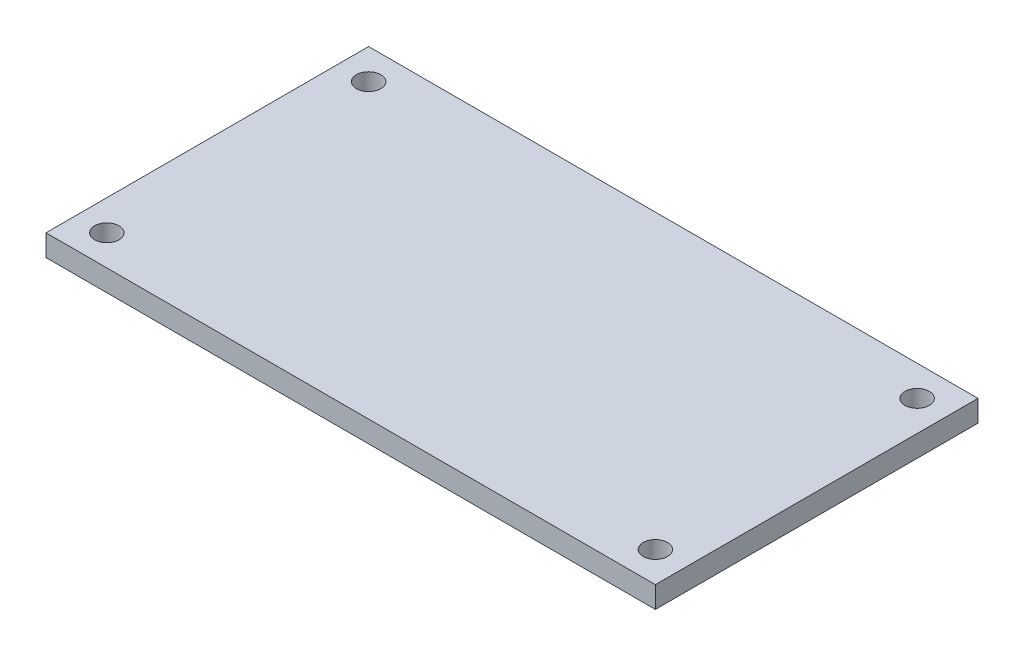
ISO-10303-21;
HEADER;
FILE_DESCRIPTION(('STEP AP214'),'2;1');
FILE_NAME('part.step','',(''),(''),'','','');
FILE_SCHEMA(('AUTOMOTIVE_DESIGN { 1 0 10303 214 1 1 1 1 }'));
ENDSEC;
DATA;
#1=APPLICATION_CONTEXT('core data for automotive mechanical design processes');
#2=APPLICATION_PROTOCOL_DEFINITION('international standard','automotive_design',2000,#1);
#3=PRODUCT_CONTEXT('',#1,'mechanical');
#4=PRODUCT('Part','Part','',(#3));
#5=PRODUCT_RELATED_PRODUCT_CATEGORY('part','',(#4));
#6=PRODUCT_DEFINITION_FORMATION('','',#4);
#7=PRODUCT_DEFINITION_CONTEXT('part definition',#1,'design');
#8=PRODUCT_DEFINITION('design','',#6,#7);
#9=PRODUCT_DEFINITION_SHAPE('','',#8);
#10=(LENGTH_UNIT() NAMED_UNIT(*) SI_UNIT(.MILLI.,.METRE.));
#11=(NAMED_UNIT(*) PLANE_ANGLE_UNIT() SI_UNIT($,.RADIAN.));
#12=(NAMED_UNIT(*) SI_UNIT($,.STERADIAN.) SOLID_ANGLE_UNIT());
#13=UNCERTAINTY_MEASURE_WITH_UNIT(LENGTH_MEASURE(1.E-05),#10,'distance_accuracy_value','');
#14=(GEOMETRIC_REPRESENTATION_CONTEXT(3) GLOBAL_UNCERTAINTY_ASSIGNED_CONTEXT((#13)) GLOBAL_UNIT_ASSIGNED_CONTEXT((#10,
#11,#12)) REPRESENTATION_CONTEXT('',''));
#15=CARTESIAN_POINT('',(0.,0.,0.));
#16=DIRECTION('',(0.,0.,1.));
#17=DIRECTION('',(1.,0.,0.));
#18=AXIS2_PLACEMENT_3D('',#15,#16,#17);
#19=CARTESIAN_POINT('',(0.,3.,0.));
#20=DIRECTION('',(0.,-1.,0.));
#21=DIRECTION('',(0.,0.,-1.));
#22=AXIS2_PLACEMENT_3D('',#19,#20,#21);
#23=PLANE('',#22);
#24=DIRECTION('',(0.,0.,1.));
#25=VECTOR('',#24,1.);
#26=CARTESIAN_POINT('',(0.,3.,0.));
#27=LINE('',#26,#25);
#28=CARTESIAN_POINT('',(0.,3.,-45.));
#29=VERTEX_POINT('',#28);
#30=CARTESIAN_POINT('',(0.,3.,0.));
#31=VERTEX_POINT('',#30);
#32=EDGE_CURVE('E94',#29,#31,#27,.T.);
#33=ORIENTED_EDGE('',*,*,#32,.T.);
#34=DIRECTION('',(1.,0.,0.));
#35=VECTOR('',#34,1.);
#36=CARTESIAN_POINT('',(0.,3.,0.));
#37=LINE('',#36,#35);
#38=CARTESIAN_POINT('',(85.,3.,0.));
#39=VERTEX_POINT('',#38);
#40=EDGE_CURVE('E89',#31,#39,#37,.T.);
#41=ORIENTED_EDGE('',*,*,#40,.T.);
#42=DIRECTION('',(0.,0.,-1.));
#43=VECTOR('',#42,1.);
#44=CARTESIAN_POINT('',(85.,3.,0.));
#45=LINE('',#44,#43);
#46=CARTESIAN_POINT('',(85.,3.,-45.));
#47=VERTEX_POINT('',#46);
#48=EDGE_CURVE('E93',#39,#47,#45,.T.);
#49=ORIENTED_EDGE('',*,*,#48,.T.);
#50=DIRECTION('',(-1.,0.,0.));
#51=VECTOR('',#50,1.);
#52=CARTESIAN_POINT('',(0.,3.,-45.));
#53=LINE('',#52,#51);
#54=EDGE_CURVE('E58',#47,#29,#53,.T.);
#55=ORIENTED_EDGE('',*,*,#54,.T.);
#56=EDGE_LOOP('',(#33,#41,#49,#55));
#57=FACE_BOUND('',#56,.T.);
#58=CARTESIAN_POINT('',(4.245,3.,-40.755));
#59=DIRECTION('',(0.,1.,0.));
#60=DIRECTION('',(0.,0.,1.));
#61=AXIS2_PLACEMENT_3D('',#58,#59,#60);
#62=CIRCLE('',#61,1.7);
#63=CARTESIAN_POINT('',(4.245,3.,-39.055));
#64=VERTEX_POINT('',#63);
#65=EDGE_CURVE('E109',#64,#64,#62,.T.);
#66=ORIENTED_EDGE('',*,*,#65,.F.);
#67=EDGE_LOOP('',(#66));
#68=FACE_BOUND('',#67,.T.);
#69=CARTESIAN_POINT('',(80.755,3.,-40.755));
#70=DIRECTION('',(0.,1.,0.));
#71=DIRECTION('',(0.,0.,1.));
#72=AXIS2_PLACEMENT_3D('',#69,#70,#71);
#73=CIRCLE('',#72,1.70000000000001);
#74=CARTESIAN_POINT('',(80.755,3.,-39.055));
#75=VERTEX_POINT('',#74);
#76=EDGE_CURVE('E124',#75,#75,#73,.T.);
#77=ORIENTED_EDGE('',*,*,#76,.F.);
#78=EDGE_LOOP('',(#77));
#79=FACE_BOUND('',#78,.T.);
#80=CARTESIAN_POINT('',(4.24499999999997,3.,-4.245));
#81=DIRECTION('',(0.,1.,0.));
#82=DIRECTION('',(0.,0.,1.));
#83=AXIS2_PLACEMENT_3D('',#80,#81,#82);
#84=CIRCLE('',#83,1.7);
#85=CARTESIAN_POINT('',(4.24499999999997,3.,-2.545));
#86=VERTEX_POINT('',#85);
#87=EDGE_CURVE('E131',#86,#86,#84,.T.);
#88=ORIENTED_EDGE('',*,*,#87,.F.);
#89=EDGE_LOOP('',(#88));
#90=FACE_BOUND('',#89,.T.);
#91=CARTESIAN_POINT('',(80.755,3.,-4.245));
#92=DIRECTION('',(0.,1.,0.));
#93=DIRECTION('',(0.,0.,1.));
#94=AXIS2_PLACEMENT_3D('',#91,#92,#93);
#95=CIRCLE('',#94,1.7);
#96=CARTESIAN_POINT('',(80.755,3.,-2.545));
#97=VERTEX_POINT('',#96);
#98=EDGE_CURVE('E140',#97,#97,#95,.T.);
#99=ORIENTED_EDGE('',*,*,#98,.F.);
#100=EDGE_LOOP('',(#99));
#101=FACE_BOUND('',#100,.T.);
#102=ADVANCED_FACE('F43',(#57,#68,#79,#90,#101),#23,.F.);
#103=CARTESIAN_POINT('',(0.,0.,0.));
#104=DIRECTION('',(0.,-1.,0.));
#105=DIRECTION('',(0.,0.,-1.));
#106=AXIS2_PLACEMENT_3D('',#103,#104,#105);
#107=PLANE('',#106);
#108=CARTESIAN_POINT('',(4.24499999999997,0.,-4.245));
#109=DIRECTION('',(0.,1.,0.));
#110=DIRECTION('',(0.,0.,1.));
#111=AXIS2_PLACEMENT_3D('',#108,#109,#110);
#112=CIRCLE('',#111,1.7);
#113=CARTESIAN_POINT('',(4.24499999999997,0.,-2.545));
#114=VERTEX_POINT('',#113);
#115=EDGE_CURVE('E132',#114,#114,#112,.T.);
#116=ORIENTED_EDGE('',*,*,#115,.T.);
#117=EDGE_LOOP('',(#116));
#118=FACE_BOUND('',#117,.T.);
#119=CARTESIAN_POINT('',(4.245,0.,-40.755));
#120=DIRECTION('',(0.,1.,0.));
#121=DIRECTION('',(0.,0.,1.));
#122=AXIS2_PLACEMENT_3D('',#119,#120,#121);
#123=CIRCLE('',#122,1.7);
#124=CARTESIAN_POINT('',(4.245,0.,-39.055));
#125=VERTEX_POINT('',#124);
#126=EDGE_CURVE('E122',#125,#125,#123,.T.);
#127=ORIENTED_EDGE('',*,*,#126,.T.);
#128=EDGE_LOOP('',(#127));
#129=FACE_BOUND('',#128,.T.);
#130=DIRECTION('',(0.,0.,1.));
#131=VECTOR('',#130,1.);
#132=CARTESIAN_POINT('',(0.,0.,0.));
#133=LINE('',#132,#131);
#134=CARTESIAN_POINT('',(0.,0.,-45.));
#135=VERTEX_POINT('',#134);
#136=CARTESIAN_POINT('',(0.,0.,0.));
#137=VERTEX_POINT('',#136);
#138=EDGE_CURVE('E110',#135,#137,#133,.T.);
#139=ORIENTED_EDGE('',*,*,#138,.F.);
#140=DIRECTION('',(-1.,0.,0.));
#141=VECTOR('',#140,1.);
#142=CARTESIAN_POINT('',(0.,0.,-45.));
#143=LINE('',#142,#141);
#144=CARTESIAN_POINT('',(85.,0.,-45.));
#145=VERTEX_POINT('',#144);
#146=EDGE_CURVE('E81',#145,#135,#143,.T.);
#147=ORIENTED_EDGE('',*,*,#146,.F.);
#148=DIRECTION('',(0.,0.,-1.));
#149=VECTOR('',#148,1.);
#150=CARTESIAN_POINT('',(85.,0.,0.));
#151=LINE('',#150,#149);
#152=CARTESIAN_POINT('',(85.,0.,0.));
#153=VERTEX_POINT('',#152);
#154=EDGE_CURVE('E77',#153,#145,#151,.T.);
#155=ORIENTED_EDGE('',*,*,#154,.F.);
#156=DIRECTION('',(1.,0.,0.));
#157=VECTOR('',#156,1.);
#158=CARTESIAN_POINT('',(0.,0.,0.));
#159=LINE('',#158,#157);
#160=EDGE_CURVE('E98',#137,#153,#159,.T.);
#161=ORIENTED_EDGE('',*,*,#160,.F.);
#162=EDGE_LOOP('',(#139,#147,#155,#161));
#163=FACE_BOUND('',#162,.T.);
#164=CARTESIAN_POINT('',(80.755,0.,-40.755));
#165=DIRECTION('',(0.,1.,0.));
#166=DIRECTION('',(0.,0.,1.));
#167=AXIS2_PLACEMENT_3D('',#164,#165,#166);
#168=CIRCLE('',#167,1.70000000000001);
#169=CARTESIAN_POINT('',(80.755,0.,-39.055));
#170=VERTEX_POINT('',#169);
#171=EDGE_CURVE('E126',#170,#170,#168,.T.);
#172=ORIENTED_EDGE('',*,*,#171,.T.);
#173=EDGE_LOOP('',(#172));
#174=FACE_BOUND('',#173,.T.);
#175=CARTESIAN_POINT('',(80.755,0.,-4.245));
#176=DIRECTION('',(0.,1.,0.));
#177=DIRECTION('',(0.,0.,1.));
#178=AXIS2_PLACEMENT_3D('',#175,#176,#177);
#179=CIRCLE('',#178,1.7);
#180=CARTESIAN_POINT('',(80.755,0.,-2.545));
#181=VERTEX_POINT('',#180);
#182=EDGE_CURVE('E139',#181,#181,#179,.T.);
#183=ORIENTED_EDGE('',*,*,#182,.T.);
#184=EDGE_LOOP('',(#183));
#185=FACE_BOUND('',#184,.T.);
#186=ADVANCED_FACE('F116',(#118,#129,#163,#174,#185),#107,.T.);
#187=CARTESIAN_POINT('',(0.,3.,0.));
#188=DIRECTION('',(1.,0.,0.));
#189=DIRECTION('',(0.,0.,-1.));
#190=AXIS2_PLACEMENT_3D('',#187,#188,#189);
#191=PLANE('',#190);
#192=ORIENTED_EDGE('',*,*,#138,.T.);
#193=DIRECTION('',(0.,-1.,0.));
#194=VECTOR('',#193,1.);
#195=CARTESIAN_POINT('',(0.,3.,0.));
#196=LINE('',#195,#194);
#197=EDGE_CURVE('E11',#31,#137,#196,.T.);
#198=ORIENTED_EDGE('',*,*,#197,.F.);
#199=ORIENTED_EDGE('',*,*,#32,.F.);
#200=DIRECTION('',(0.,-1.,0.));
#201=VECTOR('',#200,1.);
#202=CARTESIAN_POINT('',(0.,3.,-45.));
#203=LINE('',#202,#201);
#204=EDGE_CURVE('E104',#29,#135,#203,.T.);
#205=ORIENTED_EDGE('',*,*,#204,.T.);
#206=EDGE_LOOP('',(#192,#198,#199,#205));
#207=FACE_BOUND('',#206,.T.);
#208=ADVANCED_FACE('F44',(#207),#191,.F.);
#209=CARTESIAN_POINT('',(0.,3.,0.));
#210=DIRECTION('',(0.,0.,-1.));
#211=DIRECTION('',(-1.,0.,0.));
#212=AXIS2_PLACEMENT_3D('',#209,#210,#211);
#213=PLANE('',#212);
#214=ORIENTED_EDGE('',*,*,#160,.T.);
#215=DIRECTION('',(0.,-1.,0.));
#216=VECTOR('',#215,1.);
#217=CARTESIAN_POINT('',(85.,3.,0.));
#218=LINE('',#217,#216);
#219=EDGE_CURVE('E55',#39,#153,#218,.T.);
#220=ORIENTED_EDGE('',*,*,#219,.F.);
#221=ORIENTED_EDGE('',*,*,#40,.F.);
#222=ORIENTED_EDGE('',*,*,#197,.T.);
#223=EDGE_LOOP('',(#214,#220,#221,#222));
#224=FACE_BOUND('',#223,.T.);
#225=ADVANCED_FACE('F97',(#224),#213,.F.);
#226=CARTESIAN_POINT('',(85.,3.,0.));
#227=DIRECTION('',(-1.,0.,0.));
#228=DIRECTION('',(0.,0.,1.));
#229=AXIS2_PLACEMENT_3D('',#226,#227,#228);
#230=PLANE('',#229);
#231=ORIENTED_EDGE('',*,*,#154,.T.);
#232=DIRECTION('',(0.,-1.,0.));
#233=VECTOR('',#232,1.);
#234=CARTESIAN_POINT('',(85.,3.,-45.));
#235=LINE('',#234,#233);
#236=EDGE_CURVE('E99',#47,#145,#235,.T.);
#237=ORIENTED_EDGE('',*,*,#236,.F.);
#238=ORIENTED_EDGE('',*,*,#48,.F.);
#239=ORIENTED_EDGE('',*,*,#219,.T.);
#240=EDGE_LOOP('',(#231,#237,#238,#239));
#241=FACE_BOUND('',#240,.T.);
#242=ADVANCED_FACE('F102',(#241),#230,.F.);
#243=CARTESIAN_POINT('',(0.,3.,-45.));
#244=DIRECTION('',(0.,0.,1.));
#245=DIRECTION('',(1.,0.,0.));
#246=AXIS2_PLACEMENT_3D('',#243,#244,#245);
#247=PLANE('',#246);
#248=ORIENTED_EDGE('',*,*,#146,.T.);
#249=ORIENTED_EDGE('',*,*,#204,.F.);
#250=ORIENTED_EDGE('',*,*,#54,.F.);
#251=ORIENTED_EDGE('',*,*,#236,.T.);
#252=EDGE_LOOP('',(#248,#249,#250,#251));
#253=FACE_BOUND('',#252,.T.);
#254=ADVANCED_FACE('F113',(#253),#247,.F.);
#255=CARTESIAN_POINT('',(4.245,3.,-40.755));
#256=DIRECTION('',(0.,-1.,0.));
#257=DIRECTION('',(0.,0.,-1.));
#258=AXIS2_PLACEMENT_3D('',#255,#256,#257);
#259=CYLINDRICAL_SURFACE('',#258,1.7);
#260=ORIENTED_EDGE('',*,*,#65,.T.);
#261=EDGE_LOOP('',(#260));
#262=FACE_BOUND('',#261,.T.);
#263=ORIENTED_EDGE('',*,*,#126,.F.);
#264=EDGE_LOOP('',(#263));
#265=FACE_BOUND('',#264,.T.);
#266=ADVANCED_FACE('F160',(#262,#265),#259,.F.);
#267=CARTESIAN_POINT('',(80.755,3.,-40.755));
#268=DIRECTION('',(0.,-1.,0.));
#269=DIRECTION('',(0.,0.,-1.));
#270=AXIS2_PLACEMENT_3D('',#267,#268,#269);
#271=CYLINDRICAL_SURFACE('',#270,1.70000000000001);
#272=ORIENTED_EDGE('',*,*,#76,.T.);
#273=EDGE_LOOP('',(#272));
#274=FACE_BOUND('',#273,.T.);
#275=ORIENTED_EDGE('',*,*,#171,.F.);
#276=EDGE_LOOP('',(#275));
#277=FACE_BOUND('',#276,.T.);
#278=ADVANCED_FACE('F205',(#274,#277),#271,.F.);
#279=CARTESIAN_POINT('',(4.24499999999997,3.,-4.245));
#280=DIRECTION('',(0.,-1.,0.));
#281=DIRECTION('',(0.,0.,-1.));
#282=AXIS2_PLACEMENT_3D('',#279,#280,#281);
#283=CYLINDRICAL_SURFACE('',#282,1.7);
#284=ORIENTED_EDGE('',*,*,#87,.T.);
#285=EDGE_LOOP('',(#284));
#286=FACE_BOUND('',#285,.T.);
#287=ORIENTED_EDGE('',*,*,#115,.F.);
#288=EDGE_LOOP('',(#287));
#289=FACE_BOUND('',#288,.T.);
#290=ADVANCED_FACE('F209',(#286,#289),#283,.F.);
#291=CARTESIAN_POINT('',(80.755,3.,-4.245));
#292=DIRECTION('',(0.,-1.,0.));
#293=DIRECTION('',(0.,0.,-1.));
#294=AXIS2_PLACEMENT_3D('',#291,#292,#293);
#295=CYLINDRICAL_SURFACE('',#294,1.7);
#296=ORIENTED_EDGE('',*,*,#98,.T.);
#297=EDGE_LOOP('',(#296));
#298=FACE_BOUND('',#297,.T.);
#299=ORIENTED_EDGE('',*,*,#182,.F.);
#300=EDGE_LOOP('',(#299));
#301=FACE_BOUND('',#300,.T.);
#302=ADVANCED_FACE('F147',(#298,#301),#295,.F.);
#303=CLOSED_SHELL('',(#102,#186,#208,#225,#242,#254,#266,#278,#290,#302));
#304=MANIFOLD_SOLID_BREP('B2',#303);
#305=ADVANCED_BREP_SHAPE_REPRESENTATION('',(#18,#304),#14);
#306=SHAPE_DEFINITION_REPRESENTATION(#9,#305);
ENDSEC;
END-ISO-10303-21;
